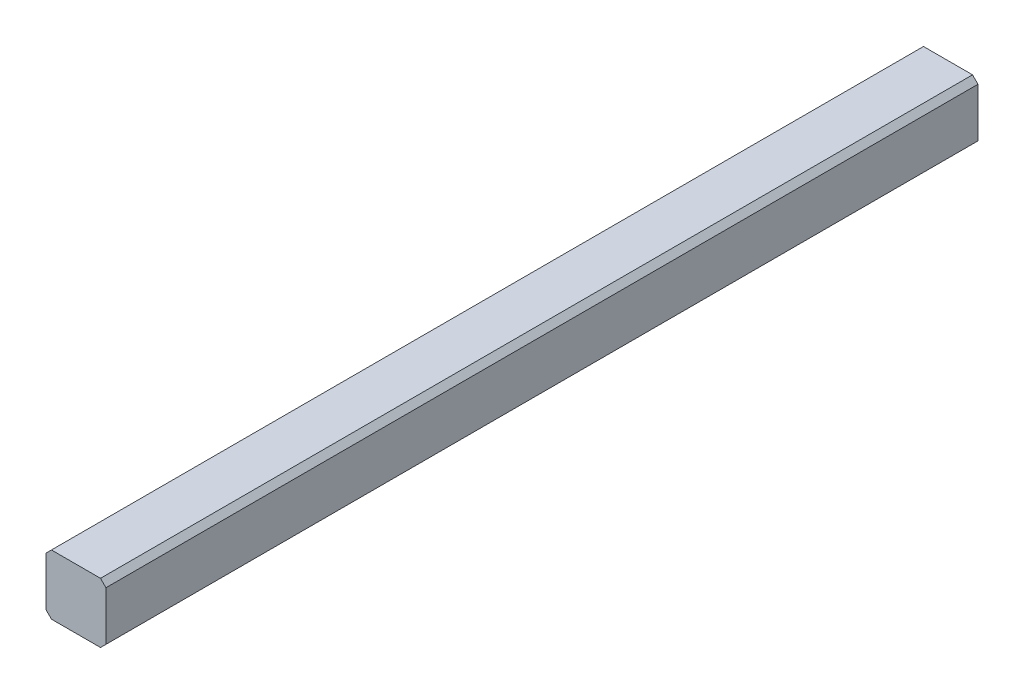
ISO-10303-21;
HEADER;
FILE_DESCRIPTION(('STEP AP214'),'2;1');
FILE_NAME('part.step','',(''),(''),'','','');
FILE_SCHEMA(('AUTOMOTIVE_DESIGN { 1 0 10303 214 1 1 1 1 }'));
ENDSEC;
DATA;
#1=APPLICATION_CONTEXT('core data for automotive mechanical design processes');
#2=APPLICATION_PROTOCOL_DEFINITION('international standard','automotive_design',2000,#1);
#3=PRODUCT_CONTEXT('',#1,'mechanical');
#4=PRODUCT('Part','Part','',(#3));
#5=PRODUCT_RELATED_PRODUCT_CATEGORY('part','',(#4));
#6=PRODUCT_DEFINITION_FORMATION('','',#4);
#7=PRODUCT_DEFINITION_CONTEXT('part definition',#1,'design');
#8=PRODUCT_DEFINITION('design','',#6,#7);
#9=PRODUCT_DEFINITION_SHAPE('','',#8);
#10=(LENGTH_UNIT() NAMED_UNIT(*) SI_UNIT(.MILLI.,.METRE.));
#11=(NAMED_UNIT(*) PLANE_ANGLE_UNIT() SI_UNIT($,.RADIAN.));
#12=(NAMED_UNIT(*) SI_UNIT($,.STERADIAN.) SOLID_ANGLE_UNIT());
#13=UNCERTAINTY_MEASURE_WITH_UNIT(LENGTH_MEASURE(1.E-05),#10,'distance_accuracy_value','');
#14=(GEOMETRIC_REPRESENTATION_CONTEXT(3) GLOBAL_UNCERTAINTY_ASSIGNED_CONTEXT((#13)) GLOBAL_UNIT_ASSIGNED_CONTEXT((#10,
#11,#12)) REPRESENTATION_CONTEXT('',''));
#15=CARTESIAN_POINT('',(0.,0.,0.));
#16=DIRECTION('',(0.,0.,1.));
#17=DIRECTION('',(1.,0.,0.));
#18=AXIS2_PLACEMENT_3D('',#15,#16,#17);
#19=CARTESIAN_POINT('',(0.,0.,800.));
#20=DIRECTION('',(1.,0.,0.));
#21=DIRECTION('',(0.,0.,-1.));
#22=AXIS2_PLACEMENT_3D('',#19,#20,#21);
#23=PLANE('',#22);
#24=CARTESIAN_POINT('',(0.,27.5,175.));
#25=DIRECTION('',(1.,0.,0.));
#26=DIRECTION('',(0.,0.,-1.));
#27=AXIS2_PLACEMENT_3D('',#24,#25,#26);
#28=CIRCLE('',#27,8.00000000000001);
#29=CARTESIAN_POINT('',(0.,35.5,175.));
#30=VERTEX_POINT('',#29);
#31=CARTESIAN_POINT('',(0.,19.5,175.));
#32=VERTEX_POINT('',#31);
#33=EDGE_CURVE('E305',#30,#32,#28,.T.);
#34=ORIENTED_EDGE('',*,*,#33,.T.);
#35=DIRECTION('',(0.,0.,-1.));
#36=VECTOR('',#35,1.);
#37=CARTESIAN_POINT('',(0.,19.5,175.));
#38=LINE('',#37,#36);
#39=CARTESIAN_POINT('',(0.,19.5,145.));
#40=VERTEX_POINT('',#39);
#41=EDGE_CURVE('E318',#32,#40,#38,.T.);
#42=ORIENTED_EDGE('',*,*,#41,.T.);
#43=CARTESIAN_POINT('',(0.,27.5,145.));
#44=DIRECTION('',(1.,0.,0.));
#45=DIRECTION('',(0.,0.,-1.));
#46=AXIS2_PLACEMENT_3D('',#43,#44,#45);
#47=CIRCLE('',#46,8.00000000000001);
#48=CARTESIAN_POINT('',(0.,35.5,145.));
#49=VERTEX_POINT('',#48);
#50=EDGE_CURVE('E321',#40,#49,#47,.T.);
#51=ORIENTED_EDGE('',*,*,#50,.T.);
#52=DIRECTION('',(0.,0.,1.));
#53=VECTOR('',#52,1.);
#54=CARTESIAN_POINT('',(0.,35.5,175.));
#55=LINE('',#54,#53);
#56=EDGE_CURVE('E324',#49,#30,#55,.T.);
#57=ORIENTED_EDGE('',*,*,#56,.T.);
#58=EDGE_LOOP('',(#34,#42,#51,#57));
#59=FACE_BOUND('',#58,.T.);
#60=DIRECTION('',(0.,-1.,0.));
#61=VECTOR('',#60,1.);
#62=CARTESIAN_POINT('',(0.,0.,800.));
#63=LINE('',#62,#61);
#64=CARTESIAN_POINT('',(0.,49.9999999999999,800.));
#65=VERTEX_POINT('',#64);
#66=CARTESIAN_POINT('',(0.,5.,800.));
#67=VERTEX_POINT('',#66);
#68=EDGE_CURVE('E419',#65,#67,#63,.T.);
#69=ORIENTED_EDGE('',*,*,#68,.F.);
#70=DIRECTION('',(0.,0.,-1.));
#71=VECTOR('',#70,1.);
#72=CARTESIAN_POINT('',(0.,49.9999999999999,800.));
#73=LINE('',#72,#71);
#74=CARTESIAN_POINT('',(0.,49.9999999999999,0.));
#75=VERTEX_POINT('',#74);
#76=EDGE_CURVE('E458',#65,#75,#73,.T.);
#77=ORIENTED_EDGE('',*,*,#76,.T.);
#78=DIRECTION('',(0.,-1.,0.));
#79=VECTOR('',#78,1.);
#80=CARTESIAN_POINT('',(0.,0.,0.));
#81=LINE('',#80,#79);
#82=CARTESIAN_POINT('',(0.,5.,0.));
#83=VERTEX_POINT('',#82);
#84=EDGE_CURVE('E413',#75,#83,#81,.T.);
#85=ORIENTED_EDGE('',*,*,#84,.T.);
#86=DIRECTION('',(0.,0.,1.));
#87=VECTOR('',#86,1.);
#88=CARTESIAN_POINT('',(0.,5.,800.));
#89=LINE('',#88,#87);
#90=EDGE_CURVE('E456',#83,#67,#89,.T.);
#91=ORIENTED_EDGE('',*,*,#90,.T.);
#92=EDGE_LOOP('',(#69,#77,#85,#91));
#93=FACE_BOUND('',#92,.T.);
#94=CARTESIAN_POINT('',(0.,27.4999999999998,765.));
#95=DIRECTION('',(1.,0.,0.));
#96=DIRECTION('',(0.,0.,-1.));
#97=AXIS2_PLACEMENT_3D('',#94,#95,#96);
#98=CIRCLE('',#97,8.);
#99=CARTESIAN_POINT('',(0.,35.4999999999998,765.));
#100=VERTEX_POINT('',#99);
#101=CARTESIAN_POINT('',(0.,19.4999999999998,765.));
#102=VERTEX_POINT('',#101);
#103=EDGE_CURVE('E265',#100,#102,#98,.T.);
#104=ORIENTED_EDGE('',*,*,#103,.T.);
#105=DIRECTION('',(0.,0.,-1.));
#106=VECTOR('',#105,1.);
#107=CARTESIAN_POINT('',(0.,19.4999999999998,765.));
#108=LINE('',#107,#106);
#109=CARTESIAN_POINT('',(0.,19.4999999999998,735.));
#110=VERTEX_POINT('',#109);
#111=EDGE_CURVE('E268',#102,#110,#108,.T.);
#112=ORIENTED_EDGE('',*,*,#111,.T.);
#113=CARTESIAN_POINT('',(0.,27.4999999999998,735.));
#114=DIRECTION('',(1.,0.,0.));
#115=DIRECTION('',(0.,0.,-1.));
#116=AXIS2_PLACEMENT_3D('',#113,#114,#115);
#117=CIRCLE('',#116,8.);
#118=CARTESIAN_POINT('',(0.,35.4999999999998,735.));
#119=VERTEX_POINT('',#118);
#120=EDGE_CURVE('E271',#110,#119,#117,.T.);
#121=ORIENTED_EDGE('',*,*,#120,.T.);
#122=DIRECTION('',(0.,0.,1.));
#123=VECTOR('',#122,1.);
#124=CARTESIAN_POINT('',(0.,35.4999999999998,765.));
#125=LINE('',#124,#123);
#126=EDGE_CURVE('E252',#119,#100,#125,.T.);
#127=ORIENTED_EDGE('',*,*,#126,.T.);
#128=EDGE_LOOP('',(#104,#112,#121,#127));
#129=FACE_BOUND('',#128,.T.);
#130=ADVANCED_FACE('F33',(#59,#93,#129),#23,.F.);
#131=CARTESIAN_POINT('',(27.4999999999999,30.,735.));
#132=DIRECTION('',(0.,-1.,0.));
#133=DIRECTION('',(0.,0.,-1.));
#134=AXIS2_PLACEMENT_3D('',#131,#132,#133);
#135=CYLINDRICAL_SURFACE('',#134,8.00000000000001);
#136=CARTESIAN_POINT('',(27.4999999999999,27.4999999999998,735.));
#137=DIRECTION('',(-0.707106781186547,-0.707106781186547,0.));
#138=DIRECTION('',(0.707106781186547,-0.707106781186547,0.));
#139=AXIS2_PLACEMENT_3D('',#136,#137,#138);
#140=ELLIPSE('',#139,11.3137084989848,8.00000000000001);
#141=CARTESIAN_POINT('',(27.4999999999999,27.4999999999998,727.));
#142=VERTEX_POINT('',#141);
#143=CARTESIAN_POINT('',(30.,24.9999999999999,727.400657923215));
#144=VERTEX_POINT('',#143);
#145=EDGE_CURVE('E291',#142,#144,#140,.T.);
#146=ORIENTED_EDGE('',*,*,#145,.F.);
#147=CARTESIAN_POINT('',(27.4999999999999,27.4999999999998,735.));
#148=DIRECTION('',(0.707106781186547,-0.707106781186547,0.));
#149=DIRECTION('',(-0.707106781186547,-0.707106781186547,0.));
#150=AXIS2_PLACEMENT_3D('',#147,#148,#149);
#151=ELLIPSE('',#150,11.3137084989848,8.00000000000001);
#152=CARTESIAN_POINT('',(19.4999999999999,19.4999999999998,735.));
#153=VERTEX_POINT('',#152);
#154=EDGE_CURVE('E286',#153,#142,#151,.T.);
#155=ORIENTED_EDGE('',*,*,#154,.F.);
#156=DIRECTION('',(0.,-1.,0.));
#157=VECTOR('',#156,1.);
#158=CARTESIAN_POINT('',(19.4999999999999,30.,735.));
#159=LINE('',#158,#157);
#160=CARTESIAN_POINT('',(19.4999999999999,0.,735.));
#161=VERTEX_POINT('',#160);
#162=EDGE_CURVE('E381',#153,#161,#159,.T.);
#163=ORIENTED_EDGE('',*,*,#162,.T.);
#164=CARTESIAN_POINT('',(27.4999999999999,0.,735.));
#165=DIRECTION('',(0.,-1.,0.));
#166=DIRECTION('',(0.,0.,-1.));
#167=AXIS2_PLACEMENT_3D('',#164,#165,#166);
#168=CIRCLE('',#167,8.00000000000001);
#169=CARTESIAN_POINT('',(35.5,0.,735.));
#170=VERTEX_POINT('',#169);
#171=EDGE_CURVE('E360',#161,#170,#168,.T.);
#172=ORIENTED_EDGE('',*,*,#171,.T.);
#173=DIRECTION('',(0.,-1.,0.));
#174=VECTOR('',#173,1.);
#175=CARTESIAN_POINT('',(35.5,30.,735.));
#176=LINE('',#175,#174);
#177=CARTESIAN_POINT('',(35.5,30.,735.));
#178=VERTEX_POINT('',#177);
#179=EDGE_CURVE('E371',#178,#170,#176,.T.);
#180=ORIENTED_EDGE('',*,*,#179,.F.);
#181=CARTESIAN_POINT('',(27.4999999999999,30.,735.));
#182=DIRECTION('',(0.,-1.,0.));
#183=DIRECTION('',(0.,0.,-1.));
#184=AXIS2_PLACEMENT_3D('',#181,#182,#183);
#185=CIRCLE('',#184,8.00000000000001);
#186=CARTESIAN_POINT('',(30.,30.,727.400657923215));
#187=VERTEX_POINT('',#186);
#188=EDGE_CURVE('E361',#187,#178,#185,.T.);
#189=ORIENTED_EDGE('',*,*,#188,.F.);
#190=DIRECTION('',(0.,-1.,0.));
#191=VECTOR('',#190,1.);
#192=CARTESIAN_POINT('',(30.,30.,727.400657923215));
#193=LINE('',#192,#191);
#194=EDGE_CURVE('E281',#187,#144,#193,.T.);
#195=ORIENTED_EDGE('',*,*,#194,.T.);
#196=EDGE_LOOP('',(#146,#155,#163,#172,#180,#189,#195));
#197=FACE_BOUND('',#196,.T.);
#198=ADVANCED_FACE('F524',(#197),#135,.F.);
#199=CARTESIAN_POINT('',(27.4999999999999,30.,765.));
#200=DIRECTION('',(0.,-1.,0.));
#201=DIRECTION('',(0.,0.,-1.));
#202=AXIS2_PLACEMENT_3D('',#199,#200,#201);
#203=CYLINDRICAL_SURFACE('',#202,8.00000000000001);
#204=CARTESIAN_POINT('',(27.4999999999999,27.4999999999998,765.));
#205=DIRECTION('',(-0.707106781186547,-0.707106781186547,0.));
#206=DIRECTION('',(0.707106781186547,-0.707106781186547,0.));
#207=AXIS2_PLACEMENT_3D('',#204,#205,#206);
#208=ELLIPSE('',#207,11.3137084989848,8.00000000000001);
#209=CARTESIAN_POINT('',(30.,24.9999999999999,772.599342076785));
#210=VERTEX_POINT('',#209);
#211=CARTESIAN_POINT('',(27.4999999999999,27.4999999999998,773.));
#212=VERTEX_POINT('',#211);
#213=EDGE_CURVE('E300',#210,#212,#208,.T.);
#214=ORIENTED_EDGE('',*,*,#213,.F.);
#215=DIRECTION('',(0.,-1.,0.));
#216=VECTOR('',#215,1.);
#217=CARTESIAN_POINT('',(30.,30.,772.599342076785));
#218=LINE('',#217,#216);
#219=CARTESIAN_POINT('',(30.,30.,772.599342076785));
#220=VERTEX_POINT('',#219);
#221=EDGE_CURVE('E278',#210,#220,#218,.F.);
#222=ORIENTED_EDGE('',*,*,#221,.T.);
#223=CARTESIAN_POINT('',(27.4999999999999,30.,765.));
#224=DIRECTION('',(0.,-1.,0.));
#225=DIRECTION('',(0.,0.,-1.));
#226=AXIS2_PLACEMENT_3D('',#223,#224,#225);
#227=CIRCLE('',#226,8.00000000000001);
#228=CARTESIAN_POINT('',(35.4999999999999,30.,765.));
#229=VERTEX_POINT('',#228);
#230=EDGE_CURVE('E369',#229,#220,#227,.T.);
#231=ORIENTED_EDGE('',*,*,#230,.F.);
#232=DIRECTION('',(0.,-1.,0.));
#233=VECTOR('',#232,1.);
#234=CARTESIAN_POINT('',(35.4999999999999,30.,765.));
#235=LINE('',#234,#233);
#236=CARTESIAN_POINT('',(35.4999999999999,0.,765.));
#237=VERTEX_POINT('',#236);
#238=EDGE_CURVE('E386',#229,#237,#235,.T.);
#239=ORIENTED_EDGE('',*,*,#238,.T.);
#240=CARTESIAN_POINT('',(27.4999999999999,0.,765.));
#241=DIRECTION('',(0.,-1.,0.));
#242=DIRECTION('',(0.,0.,-1.));
#243=AXIS2_PLACEMENT_3D('',#240,#241,#242);
#244=CIRCLE('',#243,8.00000000000001);
#245=CARTESIAN_POINT('',(19.4999999999999,0.,765.));
#246=VERTEX_POINT('',#245);
#247=EDGE_CURVE('E376',#237,#246,#244,.T.);
#248=ORIENTED_EDGE('',*,*,#247,.T.);
#249=DIRECTION('',(0.,-1.,0.));
#250=VECTOR('',#249,1.);
#251=CARTESIAN_POINT('',(19.4999999999999,30.,765.));
#252=LINE('',#251,#250);
#253=CARTESIAN_POINT('',(19.4999999999999,19.4999999999998,765.));
#254=VERTEX_POINT('',#253);
#255=EDGE_CURVE('E384',#254,#246,#252,.T.);
#256=ORIENTED_EDGE('',*,*,#255,.F.);
#257=CARTESIAN_POINT('',(27.4999999999999,27.4999999999998,765.));
#258=DIRECTION('',(0.707106781186547,-0.707106781186547,0.));
#259=DIRECTION('',(-0.707106781186547,-0.707106781186547,0.));
#260=AXIS2_PLACEMENT_3D('',#257,#258,#259);
#261=ELLIPSE('',#260,11.3137084989848,8.00000000000001);
#262=EDGE_CURVE('E296',#212,#254,#261,.T.);
#263=ORIENTED_EDGE('',*,*,#262,.F.);
#264=EDGE_LOOP('',(#214,#222,#231,#239,#248,#256,#263));
#265=FACE_BOUND('',#264,.T.);
#266=ADVANCED_FACE('F530',(#265),#203,.F.);
#267=CARTESIAN_POINT('',(27.5,30.,175.));
#268=DIRECTION('',(0.,-1.,0.));
#269=DIRECTION('',(0.,0.,-1.));
#270=AXIS2_PLACEMENT_3D('',#267,#268,#269);
#271=CYLINDRICAL_SURFACE('',#270,8.00000000000001);
#272=CARTESIAN_POINT('',(27.5,27.5,175.));
#273=DIRECTION('',(-0.707106781186547,-0.707106781186547,0.));
#274=DIRECTION('',(0.707106781186547,-0.707106781186547,0.));
#275=AXIS2_PLACEMENT_3D('',#272,#273,#274);
#276=ELLIPSE('',#275,11.3137084989848,8.00000000000001);
#277=CARTESIAN_POINT('',(30.,25.,182.599342076785));
#278=VERTEX_POINT('',#277);
#279=CARTESIAN_POINT('',(27.5,27.5,183.));
#280=VERTEX_POINT('',#279);
#281=EDGE_CURVE('E357',#278,#280,#276,.T.);
#282=ORIENTED_EDGE('',*,*,#281,.F.);
#283=DIRECTION('',(0.,-1.,0.));
#284=VECTOR('',#283,1.);
#285=CARTESIAN_POINT('',(30.,30.,182.599342076785));
#286=LINE('',#285,#284);
#287=CARTESIAN_POINT('',(30.,30.,182.599342076785));
#288=VERTEX_POINT('',#287);
#289=EDGE_CURVE('E338',#278,#288,#286,.F.);
#290=ORIENTED_EDGE('',*,*,#289,.T.);
#291=CARTESIAN_POINT('',(27.5,30.,175.));
#292=DIRECTION('',(0.,-1.,0.));
#293=DIRECTION('',(0.,0.,-1.));
#294=AXIS2_PLACEMENT_3D('',#291,#292,#293);
#295=CIRCLE('',#294,8.00000000000001);
#296=CARTESIAN_POINT('',(35.5,30.,175.));
#297=VERTEX_POINT('',#296);
#298=EDGE_CURVE('E390',#297,#288,#295,.T.);
#299=ORIENTED_EDGE('',*,*,#298,.F.);
#300=DIRECTION('',(0.,-1.,0.));
#301=VECTOR('',#300,1.);
#302=CARTESIAN_POINT('',(35.5,30.,175.));
#303=LINE('',#302,#301);
#304=CARTESIAN_POINT('',(35.5,0.,175.));
#305=VERTEX_POINT('',#304);
#306=EDGE_CURVE('E411',#297,#305,#303,.T.);
#307=ORIENTED_EDGE('',*,*,#306,.T.);
#308=CARTESIAN_POINT('',(27.5,0.,175.));
#309=DIRECTION('',(0.,-1.,0.));
#310=DIRECTION('',(0.,0.,-1.));
#311=AXIS2_PLACEMENT_3D('',#308,#309,#310);
#312=CIRCLE('',#311,8.00000000000001);
#313=CARTESIAN_POINT('',(19.5,0.,175.));
#314=VERTEX_POINT('',#313);
#315=EDGE_CURVE('E383',#305,#314,#312,.T.);
#316=ORIENTED_EDGE('',*,*,#315,.T.);
#317=DIRECTION('',(0.,-1.,0.));
#318=VECTOR('',#317,1.);
#319=CARTESIAN_POINT('',(19.5,30.,175.));
#320=LINE('',#319,#318);
#321=CARTESIAN_POINT('',(19.5,19.5,175.));
#322=VERTEX_POINT('',#321);
#323=EDGE_CURVE('E399',#322,#314,#320,.T.);
#324=ORIENTED_EDGE('',*,*,#323,.F.);
#325=CARTESIAN_POINT('',(27.5,27.5,175.));
#326=DIRECTION('',(0.707106781186547,-0.707106781186547,0.));
#327=DIRECTION('',(-0.707106781186547,-0.707106781186547,0.));
#328=AXIS2_PLACEMENT_3D('',#325,#326,#327);
#329=ELLIPSE('',#328,11.3137084989848,8.00000000000001);
#330=EDGE_CURVE('E353',#280,#322,#329,.T.);
#331=ORIENTED_EDGE('',*,*,#330,.F.);
#332=EDGE_LOOP('',(#282,#290,#299,#307,#316,#324,#331));
#333=FACE_BOUND('',#332,.T.);
#334=ADVANCED_FACE('F754',(#333),#271,.F.);
#335=CARTESIAN_POINT('',(27.5,30.,145.));
#336=DIRECTION('',(0.,-1.,0.));
#337=DIRECTION('',(0.,0.,-1.));
#338=AXIS2_PLACEMENT_3D('',#335,#336,#337);
#339=CYLINDRICAL_SURFACE('',#338,8.00000000000001);
#340=CARTESIAN_POINT('',(27.5,27.5,145.));
#341=DIRECTION('',(-0.707106781186547,-0.707106781186547,0.));
#342=DIRECTION('',(0.707106781186547,-0.707106781186547,0.));
#343=AXIS2_PLACEMENT_3D('',#340,#341,#342);
#344=ELLIPSE('',#343,11.3137084989848,8.00000000000001);
#345=CARTESIAN_POINT('',(27.5,27.5,137.));
#346=VERTEX_POINT('',#345);
#347=CARTESIAN_POINT('',(30.,25.,137.400657923215));
#348=VERTEX_POINT('',#347);
#349=EDGE_CURVE('E348',#346,#348,#344,.T.);
#350=ORIENTED_EDGE('',*,*,#349,.F.);
#351=CARTESIAN_POINT('',(27.5,27.5,145.));
#352=DIRECTION('',(0.707106781186547,-0.707106781186547,0.));
#353=DIRECTION('',(-0.707106781186547,-0.707106781186547,0.));
#354=AXIS2_PLACEMENT_3D('',#351,#352,#353);
#355=ELLIPSE('',#354,11.3137084989848,8.00000000000001);
#356=CARTESIAN_POINT('',(19.5,19.5,145.));
#357=VERTEX_POINT('',#356);
#358=EDGE_CURVE('E343',#357,#346,#355,.T.);
#359=ORIENTED_EDGE('',*,*,#358,.F.);
#360=DIRECTION('',(0.,-1.,0.));
#361=VECTOR('',#360,1.);
#362=CARTESIAN_POINT('',(19.5,30.,145.));
#363=LINE('',#362,#361);
#364=CARTESIAN_POINT('',(19.5,0.,145.));
#365=VERTEX_POINT('',#364);
#366=EDGE_CURVE('E416',#357,#365,#363,.T.);
#367=ORIENTED_EDGE('',*,*,#366,.T.);
#368=CARTESIAN_POINT('',(27.5,0.,145.));
#369=DIRECTION('',(0.,-1.,0.));
#370=DIRECTION('',(0.,0.,-1.));
#371=AXIS2_PLACEMENT_3D('',#368,#369,#370);
#372=CIRCLE('',#371,8.00000000000001);
#373=CARTESIAN_POINT('',(35.5000000000001,0.,145.));
#374=VERTEX_POINT('',#373);
#375=EDGE_CURVE('E405',#365,#374,#372,.T.);
#376=ORIENTED_EDGE('',*,*,#375,.T.);
#377=DIRECTION('',(0.,-1.,0.));
#378=VECTOR('',#377,1.);
#379=CARTESIAN_POINT('',(35.5000000000001,30.,145.));
#380=LINE('',#379,#378);
#381=CARTESIAN_POINT('',(35.5000000000001,30.,145.));
#382=VERTEX_POINT('',#381);
#383=EDGE_CURVE('E414',#382,#374,#380,.T.);
#384=ORIENTED_EDGE('',*,*,#383,.F.);
#385=CARTESIAN_POINT('',(27.5,30.,145.));
#386=DIRECTION('',(0.,-1.,0.));
#387=DIRECTION('',(0.,0.,-1.));
#388=AXIS2_PLACEMENT_3D('',#385,#386,#387);
#389=CIRCLE('',#388,8.00000000000001);
#390=CARTESIAN_POINT('',(30.,30.,137.400657923215));
#391=VERTEX_POINT('',#390);
#392=EDGE_CURVE('E392',#391,#382,#389,.T.);
#393=ORIENTED_EDGE('',*,*,#392,.F.);
#394=DIRECTION('',(0.,-1.,0.));
#395=VECTOR('',#394,1.);
#396=CARTESIAN_POINT('',(30.,30.,137.400657923215));
#397=LINE('',#396,#395);
#398=EDGE_CURVE('E335',#391,#348,#397,.T.);
#399=ORIENTED_EDGE('',*,*,#398,.T.);
#400=EDGE_LOOP('',(#350,#359,#367,#376,#384,#393,#399));
#401=FACE_BOUND('',#400,.T.);
#402=ADVANCED_FACE('F784',(#401),#339,.F.);
#403=CARTESIAN_POINT('',(0.,0.,800.));
#404=DIRECTION('',(0.,1.,0.));
#405=DIRECTION('',(0.,0.,1.));
#406=AXIS2_PLACEMENT_3D('',#403,#404,#405);
#407=PLANE('',#406);
#408=DIRECTION('',(0.,0.,1.));
#409=VECTOR('',#408,1.);
#410=CARTESIAN_POINT('',(35.5,0.,735.));
#411=LINE('',#410,#409);
#412=EDGE_CURVE('E373',#170,#237,#411,.T.);
#413=ORIENTED_EDGE('',*,*,#412,.F.);
#414=ORIENTED_EDGE('',*,*,#171,.F.);
#415=DIRECTION('',(0.,0.,-1.));
#416=VECTOR('',#415,1.);
#417=CARTESIAN_POINT('',(19.4999999999999,0.,735.));
#418=LINE('',#417,#416);
#419=EDGE_CURVE('E364',#246,#161,#418,.T.);
#420=ORIENTED_EDGE('',*,*,#419,.F.);
#421=ORIENTED_EDGE('',*,*,#247,.F.);
#422=EDGE_LOOP('',(#413,#414,#420,#421));
#423=FACE_BOUND('',#422,.T.);
#424=DIRECTION('',(0.,0.,-1.));
#425=VECTOR('',#424,1.);
#426=CARTESIAN_POINT('',(19.5,0.,175.));
#427=LINE('',#426,#425);
#428=EDGE_CURVE('E402',#314,#365,#427,.T.);
#429=ORIENTED_EDGE('',*,*,#428,.F.);
#430=ORIENTED_EDGE('',*,*,#315,.F.);
#431=DIRECTION('',(0.,0.,1.));
#432=VECTOR('',#431,1.);
#433=CARTESIAN_POINT('',(35.5,0.,175.));
#434=LINE('',#433,#432);
#435=EDGE_CURVE('E408',#374,#305,#434,.T.);
#436=ORIENTED_EDGE('',*,*,#435,.F.);
#437=ORIENTED_EDGE('',*,*,#375,.F.);
#438=EDGE_LOOP('',(#429,#430,#436,#437));
#439=FACE_BOUND('',#438,.T.);
#440=DIRECTION('',(1.,0.,0.));
#441=VECTOR('',#440,1.);
#442=CARTESIAN_POINT('',(0.,0.,0.));
#443=LINE('',#442,#441);
#444=CARTESIAN_POINT('',(5.,0.,0.));
#445=VERTEX_POINT('',#444);
#446=CARTESIAN_POINT('',(50.,0.,0.));
#447=VERTEX_POINT('',#446);
#448=EDGE_CURVE('E433',#445,#447,#443,.T.);
#449=ORIENTED_EDGE('',*,*,#448,.T.);
#450=DIRECTION('',(0.,0.,1.));
#451=VECTOR('',#450,1.);
#452=CARTESIAN_POINT('',(50.,0.,800.));
#453=LINE('',#452,#451);
#454=CARTESIAN_POINT('',(50.,0.,800.));
#455=VERTEX_POINT('',#454);
#456=EDGE_CURVE('E11',#447,#455,#453,.T.);
#457=ORIENTED_EDGE('',*,*,#456,.T.);
#458=DIRECTION('',(1.,0.,0.));
#459=VECTOR('',#458,1.);
#460=CARTESIAN_POINT('',(0.,0.,800.));
#461=LINE('',#460,#459);
#462=CARTESIAN_POINT('',(5.,0.,800.));
#463=VERTEX_POINT('',#462);
#464=EDGE_CURVE('E422',#463,#455,#461,.T.);
#465=ORIENTED_EDGE('',*,*,#464,.F.);
#466=DIRECTION('',(0.,0.,-1.));
#467=VECTOR('',#466,1.);
#468=CARTESIAN_POINT('',(5.,0.,800.));
#469=LINE('',#468,#467);
#470=EDGE_CURVE('E41',#463,#445,#469,.T.);
#471=ORIENTED_EDGE('',*,*,#470,.T.);
#472=EDGE_LOOP('',(#449,#457,#465,#471));
#473=FACE_BOUND('',#472,.T.);
#474=ADVANCED_FACE('F489',(#423,#439,#473),#407,.F.);
#475=CARTESIAN_POINT('',(55.,0.,800.));
#476=DIRECTION('',(-1.,0.,0.));
#477=DIRECTION('',(0.,0.,1.));
#478=AXIS2_PLACEMENT_3D('',#475,#476,#477);
#479=PLANE('',#478);
#480=DIRECTION('',(0.,1.,0.));
#481=VECTOR('',#480,1.);
#482=CARTESIAN_POINT('',(55.,0.,0.));
#483=LINE('',#482,#481);
#484=CARTESIAN_POINT('',(55.,5.,0.));
#485=VERTEX_POINT('',#484);
#486=CARTESIAN_POINT('',(55.,49.9999999999999,0.));
#487=VERTEX_POINT('',#486);
#488=EDGE_CURVE('E436',#485,#487,#483,.T.);
#489=ORIENTED_EDGE('',*,*,#488,.T.);
#490=DIRECTION('',(0.,0.,1.));
#491=VECTOR('',#490,1.);
#492=CARTESIAN_POINT('',(55.,49.9999999999999,800.));
#493=LINE('',#492,#491);
#494=CARTESIAN_POINT('',(55.,49.9999999999999,800.));
#495=VERTEX_POINT('',#494);
#496=EDGE_CURVE('E48',#487,#495,#493,.T.);
#497=ORIENTED_EDGE('',*,*,#496,.T.);
#498=DIRECTION('',(0.,1.,0.));
#499=VECTOR('',#498,1.);
#500=CARTESIAN_POINT('',(55.,0.,800.));
#501=LINE('',#500,#499);
#502=CARTESIAN_POINT('',(55.,5.,800.));
#503=VERTEX_POINT('',#502);
#504=EDGE_CURVE('E425',#503,#495,#501,.T.);
#505=ORIENTED_EDGE('',*,*,#504,.F.);
#506=DIRECTION('',(0.,0.,-1.));
#507=VECTOR('',#506,1.);
#508=CARTESIAN_POINT('',(55.,5.,800.));
#509=LINE('',#508,#507);
#510=EDGE_CURVE('E481',#503,#485,#509,.T.);
#511=ORIENTED_EDGE('',*,*,#510,.T.);
#512=EDGE_LOOP('',(#489,#497,#505,#511));
#513=FACE_BOUND('',#512,.T.);
#514=ADVANCED_FACE('F500',(#513),#479,.F.);
#515=CARTESIAN_POINT('',(0.,55.,800.));
#516=DIRECTION('',(0.,-1.,0.));
#517=DIRECTION('',(0.,0.,-1.));
#518=AXIS2_PLACEMENT_3D('',#515,#516,#517);
#519=PLANE('',#518);
#520=DIRECTION('',(-1.,0.,0.));
#521=VECTOR('',#520,1.);
#522=CARTESIAN_POINT('',(0.,55.,0.));
#523=LINE('',#522,#521);
#524=CARTESIAN_POINT('',(49.9999999999999,55.,0.));
#525=VERTEX_POINT('',#524);
#526=CARTESIAN_POINT('',(5.00000000000012,55.,0.));
#527=VERTEX_POINT('',#526);
#528=EDGE_CURVE('E423',#525,#527,#523,.T.);
#529=ORIENTED_EDGE('',*,*,#528,.T.);
#530=DIRECTION('',(0.,0.,1.));
#531=VECTOR('',#530,1.);
#532=CARTESIAN_POINT('',(5.00000000000012,55.,800.));
#533=LINE('',#532,#531);
#534=CARTESIAN_POINT('',(5.00000000000012,55.,800.));
#535=VERTEX_POINT('',#534);
#536=EDGE_CURVE('E472',#527,#535,#533,.T.);
#537=ORIENTED_EDGE('',*,*,#536,.T.);
#538=DIRECTION('',(-1.,0.,0.));
#539=VECTOR('',#538,1.);
#540=CARTESIAN_POINT('',(0.,55.,800.));
#541=LINE('',#540,#539);
#542=CARTESIAN_POINT('',(49.9999999999999,55.,800.));
#543=VERTEX_POINT('',#542);
#544=EDGE_CURVE('E427',#543,#535,#541,.T.);
#545=ORIENTED_EDGE('',*,*,#544,.F.);
#546=DIRECTION('',(0.,0.,-1.));
#547=VECTOR('',#546,1.);
#548=CARTESIAN_POINT('',(49.9999999999999,55.,800.));
#549=LINE('',#548,#547);
#550=EDGE_CURVE('E469',#543,#525,#549,.T.);
#551=ORIENTED_EDGE('',*,*,#550,.T.);
#552=EDGE_LOOP('',(#529,#537,#545,#551));
#553=FACE_BOUND('',#552,.T.);
#554=ADVANCED_FACE('F509',(#553),#519,.F.);
#555=CARTESIAN_POINT('',(0.,0.,800.));
#556=DIRECTION('',(0.,0.,-1.));
#557=DIRECTION('',(-1.,0.,0.));
#558=AXIS2_PLACEMENT_3D('',#555,#556,#557);
#559=PLANE('',#558);
#560=ORIENTED_EDGE('',*,*,#544,.T.);
#561=DIRECTION('',(0.707106781186548,0.707106781186548,0.));
#562=VECTOR('',#561,1.);
#563=CARTESIAN_POINT('',(0.,49.9999999999999,800.));
#564=LINE('',#563,#562);
#565=EDGE_CURVE('E479',#535,#65,#564,.F.);
#566=ORIENTED_EDGE('',*,*,#565,.T.);
#567=ORIENTED_EDGE('',*,*,#68,.T.);
#568=DIRECTION('',(-0.707106781186548,0.707106781186548,0.));
#569=VECTOR('',#568,1.);
#570=CARTESIAN_POINT('',(5.,0.,800.));
#571=LINE('',#570,#569);
#572=EDGE_CURVE('E474',#67,#463,#571,.F.);
#573=ORIENTED_EDGE('',*,*,#572,.T.);
#574=ORIENTED_EDGE('',*,*,#464,.T.);
#575=DIRECTION('',(-0.707106781186548,-0.707106781186548,0.));
#576=VECTOR('',#575,1.);
#577=CARTESIAN_POINT('',(55.,5.,800.));
#578=LINE('',#577,#576);
#579=EDGE_CURVE('E55',#455,#503,#578,.F.);
#580=ORIENTED_EDGE('',*,*,#579,.T.);
#581=ORIENTED_EDGE('',*,*,#504,.T.);
#582=DIRECTION('',(0.707106781186548,-0.707106781186548,0.));
#583=VECTOR('',#582,1.);
#584=CARTESIAN_POINT('',(49.9999999999999,55.,800.));
#585=LINE('',#584,#583);
#586=EDGE_CURVE('E477',#495,#543,#585,.F.);
#587=ORIENTED_EDGE('',*,*,#586,.T.);
#588=EDGE_LOOP('',(#560,#566,#567,#573,#574,#580,#581,#587));
#589=FACE_BOUND('',#588,.T.);
#590=ADVANCED_FACE('F502',(#589),#559,.F.);
#591=CARTESIAN_POINT('',(0.,0.,0.));
#592=DIRECTION('',(0.,0.,-1.));
#593=DIRECTION('',(-1.,0.,0.));
#594=AXIS2_PLACEMENT_3D('',#591,#592,#593);
#595=PLANE('',#594);
#596=ORIENTED_EDGE('',*,*,#84,.F.);
#597=DIRECTION('',(-0.707106781186548,-0.707106781186548,0.));
#598=VECTOR('',#597,1.);
#599=CARTESIAN_POINT('',(-24.9999999999999,24.9999999999999,0.));
#600=LINE('',#599,#598);
#601=EDGE_CURVE('E467',#75,#527,#600,.F.);
#602=ORIENTED_EDGE('',*,*,#601,.T.);
#603=ORIENTED_EDGE('',*,*,#528,.F.);
#604=DIRECTION('',(-0.707106781186548,0.707106781186548,0.));
#605=VECTOR('',#604,1.);
#606=CARTESIAN_POINT('',(52.4999999999999,52.4999999999999,0.));
#607=LINE('',#606,#605);
#608=EDGE_CURVE('E465',#525,#487,#607,.F.);
#609=ORIENTED_EDGE('',*,*,#608,.T.);
#610=ORIENTED_EDGE('',*,*,#488,.F.);
#611=DIRECTION('',(0.707106781186548,0.707106781186548,0.));
#612=VECTOR('',#611,1.);
#613=CARTESIAN_POINT('',(25.,-25.,0.));
#614=LINE('',#613,#612);
#615=EDGE_CURVE('E463',#485,#447,#614,.F.);
#616=ORIENTED_EDGE('',*,*,#615,.T.);
#617=ORIENTED_EDGE('',*,*,#448,.F.);
#618=DIRECTION('',(0.707106781186548,-0.707106781186548,0.));
#619=VECTOR('',#618,1.);
#620=CARTESIAN_POINT('',(2.5,2.5,0.));
#621=LINE('',#620,#619);
#622=EDGE_CURVE('E461',#445,#83,#621,.F.);
#623=ORIENTED_EDGE('',*,*,#622,.T.);
#624=EDGE_LOOP('',(#596,#602,#603,#609,#610,#616,#617,#623));
#625=FACE_BOUND('',#624,.T.);
#626=ADVANCED_FACE('F495',(#625),#595,.T.);
#627=CARTESIAN_POINT('',(35.5,30.,175.));
#628=DIRECTION('',(1.,0.,0.));
#629=DIRECTION('',(0.,0.,-1.));
#630=AXIS2_PLACEMENT_3D('',#627,#628,#629);
#631=PLANE('',#630);
#632=ORIENTED_EDGE('',*,*,#435,.T.);
#633=ORIENTED_EDGE('',*,*,#306,.F.);
#634=DIRECTION('',(0.,0.,1.));
#635=VECTOR('',#634,1.);
#636=CARTESIAN_POINT('',(35.5,30.,175.));
#637=LINE('',#636,#635);
#638=EDGE_CURVE('E396',#382,#297,#637,.T.);
#639=ORIENTED_EDGE('',*,*,#638,.F.);
#640=ORIENTED_EDGE('',*,*,#383,.T.);
#641=EDGE_LOOP('',(#632,#633,#639,#640));
#642=FACE_BOUND('',#641,.T.);
#643=ADVANCED_FACE('F854',(#642),#631,.F.);
#644=CARTESIAN_POINT('',(19.5,30.,175.));
#645=DIRECTION('',(-1.,0.,0.));
#646=DIRECTION('',(0.,0.,1.));
#647=AXIS2_PLACEMENT_3D('',#644,#645,#646);
#648=PLANE('',#647);
#649=DIRECTION('',(0.,0.,-1.));
#650=VECTOR('',#649,1.);
#651=CARTESIAN_POINT('',(19.5,19.5,175.));
#652=LINE('',#651,#650);
#653=EDGE_CURVE('E448',#322,#357,#652,.T.);
#654=ORIENTED_EDGE('',*,*,#653,.F.);
#655=ORIENTED_EDGE('',*,*,#323,.T.);
#656=ORIENTED_EDGE('',*,*,#428,.T.);
#657=ORIENTED_EDGE('',*,*,#366,.F.);
#658=EDGE_LOOP('',(#654,#655,#656,#657));
#659=FACE_BOUND('',#658,.T.);
#660=ADVANCED_FACE('F847',(#659),#648,.F.);
#661=CARTESIAN_POINT('',(27.5,30.,175.));
#662=DIRECTION('',(0.,-1.,0.));
#663=DIRECTION('',(0.,0.,-1.));
#664=AXIS2_PLACEMENT_3D('',#661,#662,#663);
#665=PLANE('',#664);
#666=DIRECTION('',(0.,0.,1.));
#667=VECTOR('',#666,1.);
#668=CARTESIAN_POINT('',(30.,30.,175.));
#669=LINE('',#668,#667);
#670=EDGE_CURVE('E430',#391,#288,#669,.T.);
#671=ORIENTED_EDGE('',*,*,#670,.F.);
#672=ORIENTED_EDGE('',*,*,#392,.T.);
#673=ORIENTED_EDGE('',*,*,#638,.T.);
#674=ORIENTED_EDGE('',*,*,#298,.T.);
#675=EDGE_LOOP('',(#671,#672,#673,#674));
#676=FACE_BOUND('',#675,.T.);
#677=ADVANCED_FACE('F810',(#676),#665,.T.);
#678=CARTESIAN_POINT('',(19.4999999999999,30.,735.));
#679=DIRECTION('',(-1.,0.,0.));
#680=DIRECTION('',(0.,0.,1.));
#681=AXIS2_PLACEMENT_3D('',#678,#679,#680);
#682=PLANE('',#681);
#683=DIRECTION('',(0.,0.,-1.));
#684=VECTOR('',#683,1.);
#685=CARTESIAN_POINT('',(19.4999999999999,19.4999999999998,735.));
#686=LINE('',#685,#684);
#687=EDGE_CURVE('E303',#254,#153,#686,.T.);
#688=ORIENTED_EDGE('',*,*,#687,.F.);
#689=ORIENTED_EDGE('',*,*,#255,.T.);
#690=ORIENTED_EDGE('',*,*,#419,.T.);
#691=ORIENTED_EDGE('',*,*,#162,.F.);
#692=EDGE_LOOP('',(#688,#689,#690,#691));
#693=FACE_BOUND('',#692,.T.);
#694=ADVANCED_FACE('F830',(#693),#682,.F.);
#695=CARTESIAN_POINT('',(35.5,30.,735.));
#696=DIRECTION('',(1.,0.,0.));
#697=DIRECTION('',(0.,0.,-1.));
#698=AXIS2_PLACEMENT_3D('',#695,#696,#697);
#699=PLANE('',#698);
#700=ORIENTED_EDGE('',*,*,#412,.T.);
#701=ORIENTED_EDGE('',*,*,#238,.F.);
#702=DIRECTION('',(0.,0.,1.));
#703=VECTOR('',#702,1.);
#704=CARTESIAN_POINT('',(35.5,30.,735.));
#705=LINE('',#704,#703);
#706=EDGE_CURVE('E365',#178,#229,#705,.T.);
#707=ORIENTED_EDGE('',*,*,#706,.F.);
#708=ORIENTED_EDGE('',*,*,#179,.T.);
#709=EDGE_LOOP('',(#700,#701,#707,#708));
#710=FACE_BOUND('',#709,.T.);
#711=ADVANCED_FACE('F822',(#710),#699,.F.);
#712=CARTESIAN_POINT('',(27.4999999999999,30.,735.));
#713=DIRECTION('',(0.,-1.,0.));
#714=DIRECTION('',(0.,0.,-1.));
#715=AXIS2_PLACEMENT_3D('',#712,#713,#714);
#716=PLANE('',#715);
#717=DIRECTION('',(0.,0.,1.));
#718=VECTOR('',#717,1.);
#719=CARTESIAN_POINT('',(30.,30.,735.));
#720=LINE('',#719,#718);
#721=EDGE_CURVE('E450',#187,#220,#720,.T.);
#722=ORIENTED_EDGE('',*,*,#721,.F.);
#723=ORIENTED_EDGE('',*,*,#188,.T.);
#724=ORIENTED_EDGE('',*,*,#706,.T.);
#725=ORIENTED_EDGE('',*,*,#230,.T.);
#726=EDGE_LOOP('',(#722,#723,#724,#725));
#727=FACE_BOUND('',#726,.T.);
#728=ADVANCED_FACE('F718',(#727),#716,.T.);
#729=CARTESIAN_POINT('',(30.,27.5,175.));
#730=DIRECTION('',(1.,0.,0.));
#731=DIRECTION('',(0.,0.,-1.));
#732=AXIS2_PLACEMENT_3D('',#729,#730,#731);
#733=PLANE('',#732);
#734=ORIENTED_EDGE('',*,*,#670,.T.);
#735=CARTESIAN_POINT('',(30.,27.5,175.));
#736=DIRECTION('',(1.,0.,0.));
#737=DIRECTION('',(0.,0.,-1.));
#738=AXIS2_PLACEMENT_3D('',#735,#736,#737);
#739=CIRCLE('',#738,8.00000000000001);
#740=CARTESIAN_POINT('',(30.,35.5,175.));
#741=VERTEX_POINT('',#740);
#742=EDGE_CURVE('E306',#741,#288,#739,.T.);
#743=ORIENTED_EDGE('',*,*,#742,.F.);
#744=DIRECTION('',(0.,0.,1.));
#745=VECTOR('',#744,1.);
#746=CARTESIAN_POINT('',(30.,35.5,175.));
#747=LINE('',#746,#745);
#748=CARTESIAN_POINT('',(30.,35.5,145.));
#749=VERTEX_POINT('',#748);
#750=EDGE_CURVE('E313',#749,#741,#747,.T.);
#751=ORIENTED_EDGE('',*,*,#750,.F.);
#752=CARTESIAN_POINT('',(30.,27.5,145.));
#753=DIRECTION('',(1.,0.,0.));
#754=DIRECTION('',(0.,0.,-1.));
#755=AXIS2_PLACEMENT_3D('',#752,#753,#754);
#756=CIRCLE('',#755,8.00000000000001);
#757=EDGE_CURVE('E309',#391,#749,#756,.T.);
#758=ORIENTED_EDGE('',*,*,#757,.F.);
#759=EDGE_LOOP('',(#734,#743,#751,#758));
#760=FACE_BOUND('',#759,.T.);
#761=ADVANCED_FACE('F649',(#760),#733,.F.);
#762=CARTESIAN_POINT('',(30.,35.5,175.));
#763=DIRECTION('',(0.,-1.,0.));
#764=DIRECTION('',(0.,0.,-1.));
#765=AXIS2_PLACEMENT_3D('',#762,#763,#764);
#766=PLANE('',#765);
#767=ORIENTED_EDGE('',*,*,#56,.F.);
#768=DIRECTION('',(-1.,0.,0.));
#769=VECTOR('',#768,1.);
#770=CARTESIAN_POINT('',(30.,35.5,145.));
#771=LINE('',#770,#769);
#772=EDGE_CURVE('E329',#749,#49,#771,.T.);
#773=ORIENTED_EDGE('',*,*,#772,.F.);
#774=ORIENTED_EDGE('',*,*,#750,.T.);
#775=DIRECTION('',(-1.,0.,0.));
#776=VECTOR('',#775,1.);
#777=CARTESIAN_POINT('',(30.,35.5,175.));
#778=LINE('',#777,#776);
#779=EDGE_CURVE('E315',#741,#30,#778,.T.);
#780=ORIENTED_EDGE('',*,*,#779,.T.);
#781=EDGE_LOOP('',(#767,#773,#774,#780));
#782=FACE_BOUND('',#781,.T.);
#783=ADVANCED_FACE('F702',(#782),#766,.T.);
#784=CARTESIAN_POINT('',(30.,27.5,145.));
#785=DIRECTION('',(-1.,0.,0.));
#786=DIRECTION('',(0.,0.,1.));
#787=AXIS2_PLACEMENT_3D('',#784,#785,#786);
#788=CYLINDRICAL_SURFACE('',#787,8.00000000000001);
#789=CARTESIAN_POINT('',(27.5,27.5,145.));
#790=DIRECTION('',(-0.707106781186547,-0.707106781186547,0.));
#791=DIRECTION('',(0.707106781186547,-0.707106781186547,0.));
#792=AXIS2_PLACEMENT_3D('',#789,#790,#791);
#793=ELLIPSE('',#792,11.3137084989848,8.00000000000001);
#794=CARTESIAN_POINT('',(25.,30.,137.400657923215));
#795=VERTEX_POINT('',#794);
#796=EDGE_CURVE('E346',#346,#795,#793,.F.);
#797=ORIENTED_EDGE('',*,*,#796,.T.);
#798=DIRECTION('',(-1.,0.,0.));
#799=VECTOR('',#798,1.);
#800=CARTESIAN_POINT('',(30.,30.,137.400657923215));
#801=LINE('',#800,#799);
#802=EDGE_CURVE('E442',#391,#795,#801,.T.);
#803=ORIENTED_EDGE('',*,*,#802,.F.);
#804=ORIENTED_EDGE('',*,*,#757,.T.);
#805=ORIENTED_EDGE('',*,*,#772,.T.);
#806=ORIENTED_EDGE('',*,*,#50,.F.);
#807=DIRECTION('',(-1.,0.,0.));
#808=VECTOR('',#807,1.);
#809=CARTESIAN_POINT('',(30.,19.5,145.));
#810=LINE('',#809,#808);
#811=EDGE_CURVE('E331',#357,#40,#810,.T.);
#812=ORIENTED_EDGE('',*,*,#811,.F.);
#813=ORIENTED_EDGE('',*,*,#358,.T.);
#814=EDGE_LOOP('',(#797,#803,#804,#805,#806,#812,#813));
#815=FACE_BOUND('',#814,.T.);
#816=ADVANCED_FACE('F668',(#815),#788,.F.);
#817=CARTESIAN_POINT('',(30.,27.5,175.));
#818=DIRECTION('',(-1.,0.,0.));
#819=DIRECTION('',(0.,0.,1.));
#820=AXIS2_PLACEMENT_3D('',#817,#818,#819);
#821=CYLINDRICAL_SURFACE('',#820,8.00000000000001);
#822=CARTESIAN_POINT('',(27.5,27.5,175.));
#823=DIRECTION('',(-0.707106781186547,-0.707106781186547,0.));
#824=DIRECTION('',(0.707106781186547,-0.707106781186547,0.));
#825=AXIS2_PLACEMENT_3D('',#822,#823,#824);
#826=ELLIPSE('',#825,11.3137084989848,8.00000000000001);
#827=CARTESIAN_POINT('',(25.,30.,182.599342076785));
#828=VERTEX_POINT('',#827);
#829=EDGE_CURVE('E355',#828,#280,#826,.F.);
#830=ORIENTED_EDGE('',*,*,#829,.T.);
#831=ORIENTED_EDGE('',*,*,#330,.T.);
#832=DIRECTION('',(-1.,0.,0.));
#833=VECTOR('',#832,1.);
#834=CARTESIAN_POINT('',(30.,19.5,175.));
#835=LINE('',#834,#833);
#836=EDGE_CURVE('E333',#322,#32,#835,.T.);
#837=ORIENTED_EDGE('',*,*,#836,.T.);
#838=ORIENTED_EDGE('',*,*,#33,.F.);
#839=ORIENTED_EDGE('',*,*,#779,.F.);
#840=ORIENTED_EDGE('',*,*,#742,.T.);
#841=DIRECTION('',(-1.,0.,0.));
#842=VECTOR('',#841,1.);
#843=CARTESIAN_POINT('',(30.,30.,182.599342076785));
#844=LINE('',#843,#842);
#845=EDGE_CURVE('E445',#828,#288,#844,.F.);
#846=ORIENTED_EDGE('',*,*,#845,.F.);
#847=EDGE_LOOP('',(#830,#831,#837,#838,#839,#840,#846));
#848=FACE_BOUND('',#847,.T.);
#849=ADVANCED_FACE('F659',(#848),#821,.F.);
#850=CARTESIAN_POINT('',(30.,19.5,175.));
#851=DIRECTION('',(0.,1.,0.));
#852=DIRECTION('',(0.,0.,1.));
#853=AXIS2_PLACEMENT_3D('',#850,#851,#852);
#854=PLANE('',#853);
#855=ORIENTED_EDGE('',*,*,#653,.T.);
#856=ORIENTED_EDGE('',*,*,#811,.T.);
#857=ORIENTED_EDGE('',*,*,#41,.F.);
#858=ORIENTED_EDGE('',*,*,#836,.F.);
#859=EDGE_LOOP('',(#855,#856,#857,#858));
#860=FACE_BOUND('',#859,.T.);
#861=ADVANCED_FACE('F679',(#860),#854,.T.);
#862=EDGE_CURVE('E395',#795,#391,#389,.T.);
#863=ORIENTED_EDGE('',*,*,#862,.T.);
#864=ORIENTED_EDGE('',*,*,#802,.T.);
#865=EDGE_LOOP('',(#863,#864));
#866=FACE_BOUND('',#865,.T.);
#867=ADVANCED_FACE('F685',(#866),#665,.T.);
#868=ORIENTED_EDGE('',*,*,#796,.F.);
#869=CARTESIAN_POINT('',(27.5,27.5,145.));
#870=DIRECTION('',(0.707106781186547,-0.707106781186547,0.));
#871=DIRECTION('',(-0.707106781186547,-0.707106781186547,0.));
#872=AXIS2_PLACEMENT_3D('',#869,#870,#871);
#873=ELLIPSE('',#872,11.3137084989848,8.00000000000001);
#874=EDGE_CURVE('E341',#391,#346,#873,.F.);
#875=ORIENTED_EDGE('',*,*,#874,.F.);
#876=ORIENTED_EDGE('',*,*,#862,.F.);
#877=EDGE_LOOP('',(#868,#875,#876));
#878=FACE_BOUND('',#877,.T.);
#879=ADVANCED_FACE('F788',(#878),#339,.F.);
#880=EDGE_CURVE('E393',#288,#828,#295,.T.);
#881=ORIENTED_EDGE('',*,*,#880,.T.);
#882=ORIENTED_EDGE('',*,*,#845,.T.);
#883=EDGE_LOOP('',(#881,#882));
#884=FACE_BOUND('',#883,.T.);
#885=ADVANCED_FACE('F775',(#884),#665,.T.);
#886=ORIENTED_EDGE('',*,*,#829,.F.);
#887=ORIENTED_EDGE('',*,*,#880,.F.);
#888=CARTESIAN_POINT('',(27.5,27.5,175.));
#889=DIRECTION('',(0.707106781186547,-0.707106781186547,0.));
#890=DIRECTION('',(-0.707106781186547,-0.707106781186547,0.));
#891=AXIS2_PLACEMENT_3D('',#888,#889,#890);
#892=ELLIPSE('',#891,11.3137084989848,8.00000000000001);
#893=EDGE_CURVE('E350',#280,#288,#892,.F.);
#894=ORIENTED_EDGE('',*,*,#893,.F.);
#895=EDGE_LOOP('',(#886,#887,#894));
#896=FACE_BOUND('',#895,.T.);
#897=ADVANCED_FACE('F675',(#896),#271,.F.);
#898=EDGE_CURVE('E312',#348,#391,#756,.T.);
#899=ORIENTED_EDGE('',*,*,#898,.F.);
#900=ORIENTED_EDGE('',*,*,#398,.F.);
#901=EDGE_LOOP('',(#899,#900));
#902=FACE_BOUND('',#901,.T.);
#903=ADVANCED_FACE('F648',(#902),#733,.F.);
#904=ORIENTED_EDGE('',*,*,#349,.T.);
#905=ORIENTED_EDGE('',*,*,#898,.T.);
#906=ORIENTED_EDGE('',*,*,#874,.T.);
#907=EDGE_LOOP('',(#904,#905,#906));
#908=FACE_BOUND('',#907,.T.);
#909=ADVANCED_FACE('F656',(#908),#788,.F.);
#910=ORIENTED_EDGE('',*,*,#281,.T.);
#911=ORIENTED_EDGE('',*,*,#893,.T.);
#912=EDGE_CURVE('E310',#288,#278,#739,.T.);
#913=ORIENTED_EDGE('',*,*,#912,.T.);
#914=EDGE_LOOP('',(#910,#911,#913));
#915=FACE_BOUND('',#914,.T.);
#916=ADVANCED_FACE('F645',(#915),#821,.F.);
#917=ORIENTED_EDGE('',*,*,#912,.F.);
#918=ORIENTED_EDGE('',*,*,#289,.F.);
#919=EDGE_LOOP('',(#917,#918));
#920=FACE_BOUND('',#919,.T.);
#921=ADVANCED_FACE('F638',(#920),#733,.F.);
#922=CARTESIAN_POINT('',(30.,27.4999999999998,765.));
#923=DIRECTION('',(1.,0.,0.));
#924=DIRECTION('',(0.,0.,-1.));
#925=AXIS2_PLACEMENT_3D('',#922,#923,#924);
#926=PLANE('',#925);
#927=ORIENTED_EDGE('',*,*,#721,.T.);
#928=CARTESIAN_POINT('',(30.,27.4999999999998,765.));
#929=DIRECTION('',(1.,0.,0.));
#930=DIRECTION('',(0.,0.,-1.));
#931=AXIS2_PLACEMENT_3D('',#928,#929,#930);
#932=CIRCLE('',#931,8.);
#933=CARTESIAN_POINT('',(30.,35.4999999999998,765.));
#934=VERTEX_POINT('',#933);
#935=EDGE_CURVE('E244',#934,#220,#932,.T.);
#936=ORIENTED_EDGE('',*,*,#935,.F.);
#937=DIRECTION('',(0.,0.,1.));
#938=VECTOR('',#937,1.);
#939=CARTESIAN_POINT('',(30.,35.4999999999998,765.));
#940=LINE('',#939,#938);
#941=CARTESIAN_POINT('',(30.,35.4999999999998,735.));
#942=VERTEX_POINT('',#941);
#943=EDGE_CURVE('E249',#942,#934,#940,.T.);
#944=ORIENTED_EDGE('',*,*,#943,.F.);
#945=CARTESIAN_POINT('',(30.,27.4999999999998,735.));
#946=DIRECTION('',(1.,0.,0.));
#947=DIRECTION('',(0.,0.,-1.));
#948=AXIS2_PLACEMENT_3D('',#945,#946,#947);
#949=CIRCLE('',#948,8.);
#950=EDGE_CURVE('E231',#187,#942,#949,.T.);
#951=ORIENTED_EDGE('',*,*,#950,.F.);
#952=EDGE_LOOP('',(#927,#936,#944,#951));
#953=FACE_BOUND('',#952,.T.);
#954=ADVANCED_FACE('F258',(#953),#926,.F.);
#955=CARTESIAN_POINT('',(30.,35.4999999999998,765.));
#956=DIRECTION('',(0.,-1.,0.));
#957=DIRECTION('',(0.,0.,-1.));
#958=AXIS2_PLACEMENT_3D('',#955,#956,#957);
#959=PLANE('',#958);
#960=ORIENTED_EDGE('',*,*,#126,.F.);
#961=DIRECTION('',(-1.,0.,0.));
#962=VECTOR('',#961,1.);
#963=CARTESIAN_POINT('',(30.,35.4999999999998,735.));
#964=LINE('',#963,#962);
#965=EDGE_CURVE('E235',#942,#119,#964,.T.);
#966=ORIENTED_EDGE('',*,*,#965,.F.);
#967=ORIENTED_EDGE('',*,*,#943,.T.);
#968=DIRECTION('',(-1.,0.,0.));
#969=VECTOR('',#968,1.);
#970=CARTESIAN_POINT('',(30.,35.4999999999998,765.));
#971=LINE('',#970,#969);
#972=EDGE_CURVE('E255',#934,#100,#971,.T.);
#973=ORIENTED_EDGE('',*,*,#972,.T.);
#974=EDGE_LOOP('',(#960,#966,#967,#973));
#975=FACE_BOUND('',#974,.T.);
#976=ADVANCED_FACE('F247',(#975),#959,.T.);
#977=CARTESIAN_POINT('',(30.,27.4999999999998,735.));
#978=DIRECTION('',(-1.,0.,0.));
#979=DIRECTION('',(0.,0.,1.));
#980=AXIS2_PLACEMENT_3D('',#977,#978,#979);
#981=CYLINDRICAL_SURFACE('',#980,8.);
#982=CARTESIAN_POINT('',(27.4999999999999,27.4999999999998,735.));
#983=DIRECTION('',(-0.707106781186547,-0.707106781186547,0.));
#984=DIRECTION('',(0.707106781186547,-0.707106781186547,0.));
#985=AXIS2_PLACEMENT_3D('',#982,#983,#984);
#986=ELLIPSE('',#985,11.3137084989848,8.00000000000001);
#987=CARTESIAN_POINT('',(24.9999999999996,30.,727.400657923215));
#988=VERTEX_POINT('',#987);
#989=EDGE_CURVE('E289',#142,#988,#986,.F.);
#990=ORIENTED_EDGE('',*,*,#989,.T.);
#991=DIRECTION('',(-1.,0.,0.));
#992=VECTOR('',#991,1.);
#993=CARTESIAN_POINT('',(30.,30.,727.400657923215));
#994=LINE('',#993,#992);
#995=EDGE_CURVE('E238',#187,#988,#994,.T.);
#996=ORIENTED_EDGE('',*,*,#995,.F.);
#997=ORIENTED_EDGE('',*,*,#950,.T.);
#998=ORIENTED_EDGE('',*,*,#965,.T.);
#999=ORIENTED_EDGE('',*,*,#120,.F.);
#1000=DIRECTION('',(-1.,0.,0.));
#1001=VECTOR('',#1000,1.);
#1002=CARTESIAN_POINT('',(30.,19.4999999999998,735.));
#1003=LINE('',#1002,#1001);
#1004=EDGE_CURVE('E254',#153,#110,#1003,.T.);
#1005=ORIENTED_EDGE('',*,*,#1004,.F.);
#1006=ORIENTED_EDGE('',*,*,#154,.T.);
#1007=EDGE_LOOP('',(#990,#996,#997,#998,#999,#1005,#1006));
#1008=FACE_BOUND('',#1007,.T.);
#1009=ADVANCED_FACE('F233',(#1008),#981,.F.);
#1010=CARTESIAN_POINT('',(30.,27.4999999999998,765.));
#1011=DIRECTION('',(-1.,0.,0.));
#1012=DIRECTION('',(0.,0.,1.));
#1013=AXIS2_PLACEMENT_3D('',#1010,#1011,#1012);
#1014=CYLINDRICAL_SURFACE('',#1013,8.);
#1015=CARTESIAN_POINT('',(27.4999999999999,27.4999999999998,765.));
#1016=DIRECTION('',(-0.707106781186547,-0.707106781186547,0.));
#1017=DIRECTION('',(0.707106781186547,-0.707106781186547,0.));
#1018=AXIS2_PLACEMENT_3D('',#1015,#1016,#1017);
#1019=ELLIPSE('',#1018,11.3137084989848,8.00000000000001);
#1020=CARTESIAN_POINT('',(24.9999999999996,30.,772.599342076785));
#1021=VERTEX_POINT('',#1020);
#1022=EDGE_CURVE('E298',#1021,#212,#1019,.F.);
#1023=ORIENTED_EDGE('',*,*,#1022,.T.);
#1024=ORIENTED_EDGE('',*,*,#262,.T.);
#1025=DIRECTION('',(-1.,0.,0.));
#1026=VECTOR('',#1025,1.);
#1027=CARTESIAN_POINT('',(30.,19.4999999999998,765.));
#1028=LINE('',#1027,#1026);
#1029=EDGE_CURVE('E276',#254,#102,#1028,.T.);
#1030=ORIENTED_EDGE('',*,*,#1029,.T.);
#1031=ORIENTED_EDGE('',*,*,#103,.F.);
#1032=ORIENTED_EDGE('',*,*,#972,.F.);
#1033=ORIENTED_EDGE('',*,*,#935,.T.);
#1034=DIRECTION('',(-1.,0.,0.));
#1035=VECTOR('',#1034,1.);
#1036=CARTESIAN_POINT('',(30.,30.,772.599342076785));
#1037=LINE('',#1036,#1035);
#1038=EDGE_CURVE('E453',#1021,#220,#1037,.F.);
#1039=ORIENTED_EDGE('',*,*,#1038,.F.);
#1040=EDGE_LOOP('',(#1023,#1024,#1030,#1031,#1032,#1033,#1039));
#1041=FACE_BOUND('',#1040,.T.);
#1042=ADVANCED_FACE('F591',(#1041),#1014,.F.);
#1043=CARTESIAN_POINT('',(30.,19.4999999999998,765.));
#1044=DIRECTION('',(0.,1.,0.));
#1045=DIRECTION('',(0.,0.,1.));
#1046=AXIS2_PLACEMENT_3D('',#1043,#1044,#1045);
#1047=PLANE('',#1046);
#1048=ORIENTED_EDGE('',*,*,#687,.T.);
#1049=ORIENTED_EDGE('',*,*,#1004,.T.);
#1050=ORIENTED_EDGE('',*,*,#111,.F.);
#1051=ORIENTED_EDGE('',*,*,#1029,.F.);
#1052=EDGE_LOOP('',(#1048,#1049,#1050,#1051));
#1053=FACE_BOUND('',#1052,.T.);
#1054=ADVANCED_FACE('F602',(#1053),#1047,.T.);
#1055=EDGE_CURVE('E363',#988,#187,#185,.T.);
#1056=ORIENTED_EDGE('',*,*,#1055,.T.);
#1057=ORIENTED_EDGE('',*,*,#995,.T.);
#1058=EDGE_LOOP('',(#1056,#1057));
#1059=FACE_BOUND('',#1058,.T.);
#1060=ADVANCED_FACE('F608',(#1059),#716,.T.);
#1061=ORIENTED_EDGE('',*,*,#989,.F.);
#1062=CARTESIAN_POINT('',(27.4999999999999,27.4999999999998,735.));
#1063=DIRECTION('',(0.707106781186547,-0.707106781186547,0.));
#1064=DIRECTION('',(-0.707106781186547,-0.707106781186547,0.));
#1065=AXIS2_PLACEMENT_3D('',#1062,#1063,#1064);
#1066=ELLIPSE('',#1065,11.3137084989848,8.00000000000001);
#1067=EDGE_CURVE('E284',#187,#142,#1066,.F.);
#1068=ORIENTED_EDGE('',*,*,#1067,.F.);
#1069=ORIENTED_EDGE('',*,*,#1055,.F.);
#1070=EDGE_LOOP('',(#1061,#1068,#1069));
#1071=FACE_BOUND('',#1070,.T.);
#1072=ADVANCED_FACE('F533',(#1071),#135,.F.);
#1073=EDGE_CURVE('E368',#220,#1021,#227,.T.);
#1074=ORIENTED_EDGE('',*,*,#1073,.T.);
#1075=ORIENTED_EDGE('',*,*,#1038,.T.);
#1076=EDGE_LOOP('',(#1074,#1075));
#1077=FACE_BOUND('',#1076,.T.);
#1078=ADVANCED_FACE('F732',(#1077),#716,.T.);
#1079=ORIENTED_EDGE('',*,*,#1022,.F.);
#1080=ORIENTED_EDGE('',*,*,#1073,.F.);
#1081=CARTESIAN_POINT('',(27.4999999999999,27.4999999999998,765.));
#1082=DIRECTION('',(0.707106781186547,-0.707106781186547,0.));
#1083=DIRECTION('',(-0.707106781186547,-0.707106781186547,0.));
#1084=AXIS2_PLACEMENT_3D('',#1081,#1082,#1083);
#1085=ELLIPSE('',#1084,11.3137084989848,8.00000000000001);
#1086=EDGE_CURVE('E293',#212,#220,#1085,.F.);
#1087=ORIENTED_EDGE('',*,*,#1086,.F.);
#1088=EDGE_LOOP('',(#1079,#1080,#1087));
#1089=FACE_BOUND('',#1088,.T.);
#1090=ADVANCED_FACE('F598',(#1089),#203,.F.);
#1091=EDGE_CURVE('E273',#220,#210,#932,.T.);
#1092=ORIENTED_EDGE('',*,*,#1091,.F.);
#1093=ORIENTED_EDGE('',*,*,#221,.F.);
#1094=EDGE_LOOP('',(#1092,#1093));
#1095=FACE_BOUND('',#1094,.T.);
#1096=ADVANCED_FACE('F573',(#1095),#926,.F.);
#1097=ORIENTED_EDGE('',*,*,#213,.T.);
#1098=ORIENTED_EDGE('',*,*,#1086,.T.);
#1099=ORIENTED_EDGE('',*,*,#1091,.T.);
#1100=EDGE_LOOP('',(#1097,#1098,#1099));
#1101=FACE_BOUND('',#1100,.T.);
#1102=ADVANCED_FACE('F580',(#1101),#1014,.F.);
#1103=ORIENTED_EDGE('',*,*,#145,.T.);
#1104=EDGE_CURVE('E243',#144,#187,#949,.T.);
#1105=ORIENTED_EDGE('',*,*,#1104,.T.);
#1106=ORIENTED_EDGE('',*,*,#1067,.T.);
#1107=EDGE_LOOP('',(#1103,#1105,#1106));
#1108=FACE_BOUND('',#1107,.T.);
#1109=ADVANCED_FACE('F570',(#1108),#981,.F.);
#1110=ORIENTED_EDGE('',*,*,#1104,.F.);
#1111=ORIENTED_EDGE('',*,*,#194,.F.);
#1112=EDGE_LOOP('',(#1110,#1111));
#1113=FACE_BOUND('',#1112,.T.);
#1114=ADVANCED_FACE('F539',(#1113),#926,.F.);
#1115=CARTESIAN_POINT('',(0.,49.9999999999999,800.));
#1116=DIRECTION('',(0.707106781186548,-0.707106781186548,0.));
#1117=DIRECTION('',(0.,0.,-1.));
#1118=AXIS2_PLACEMENT_3D('',#1115,#1116,#1117);
#1119=PLANE('',#1118);
#1120=ORIENTED_EDGE('',*,*,#565,.F.);
#1121=ORIENTED_EDGE('',*,*,#536,.F.);
#1122=ORIENTED_EDGE('',*,*,#601,.F.);
#1123=ORIENTED_EDGE('',*,*,#76,.F.);
#1124=EDGE_LOOP('',(#1120,#1121,#1122,#1123));
#1125=FACE_BOUND('',#1124,.T.);
#1126=ADVANCED_FACE('F514',(#1125),#1119,.F.);
#1127=CARTESIAN_POINT('',(49.9999999999999,55.,800.));
#1128=DIRECTION('',(-0.707106781186548,-0.707106781186548,0.));
#1129=DIRECTION('',(0.,0.,-1.));
#1130=AXIS2_PLACEMENT_3D('',#1127,#1128,#1129);
#1131=PLANE('',#1130);
#1132=ORIENTED_EDGE('',*,*,#586,.F.);
#1133=ORIENTED_EDGE('',*,*,#496,.F.);
#1134=ORIENTED_EDGE('',*,*,#608,.F.);
#1135=ORIENTED_EDGE('',*,*,#550,.F.);
#1136=EDGE_LOOP('',(#1132,#1133,#1134,#1135));
#1137=FACE_BOUND('',#1136,.T.);
#1138=ADVANCED_FACE('F506',(#1137),#1131,.F.);
#1139=CARTESIAN_POINT('',(55.,5.,800.));
#1140=DIRECTION('',(-0.707106781186547,0.707106781186547,0.));
#1141=DIRECTION('',(0.,0.,-1.));
#1142=AXIS2_PLACEMENT_3D('',#1139,#1140,#1141);
#1143=PLANE('',#1142);
#1144=ORIENTED_EDGE('',*,*,#579,.F.);
#1145=ORIENTED_EDGE('',*,*,#456,.F.);
#1146=ORIENTED_EDGE('',*,*,#615,.F.);
#1147=ORIENTED_EDGE('',*,*,#510,.F.);
#1148=EDGE_LOOP('',(#1144,#1145,#1146,#1147));
#1149=FACE_BOUND('',#1148,.T.);
#1150=ADVANCED_FACE('F499',(#1149),#1143,.F.);
#1151=CARTESIAN_POINT('',(5.,0.,800.));
#1152=DIRECTION('',(0.707106781186547,0.707106781186547,0.));
#1153=DIRECTION('',(0.,0.,-1.));
#1154=AXIS2_PLACEMENT_3D('',#1151,#1152,#1153);
#1155=PLANE('',#1154);
#1156=ORIENTED_EDGE('',*,*,#572,.F.);
#1157=ORIENTED_EDGE('',*,*,#90,.F.);
#1158=ORIENTED_EDGE('',*,*,#622,.F.);
#1159=ORIENTED_EDGE('',*,*,#470,.F.);
#1160=EDGE_LOOP('',(#1156,#1157,#1158,#1159));
#1161=FACE_BOUND('',#1160,.T.);
#1162=ADVANCED_FACE('F35',(#1161),#1155,.F.);
#1163=CLOSED_SHELL('',(#130,#198,#266,#334,#402,#474,#514,#554,#590,#626,#643,#660,#677,#694,
#711,#728,#761,#783,#816,#849,#861,#867,#879,#885,#897,#903,#909,#916,#921,#954,#976,#1009,
#1042,#1054,#1060,#1072,#1078,#1090,#1096,#1102,#1109,#1114,#1126,#1138,#1150,#1162));
#1164=MANIFOLD_SOLID_BREP('B2',#1163);
#1165=ADVANCED_BREP_SHAPE_REPRESENTATION('',(#18,#1164),#14);
#1166=SHAPE_DEFINITION_REPRESENTATION(#9,#1165);
ENDSEC;
END-ISO-10303-21;
